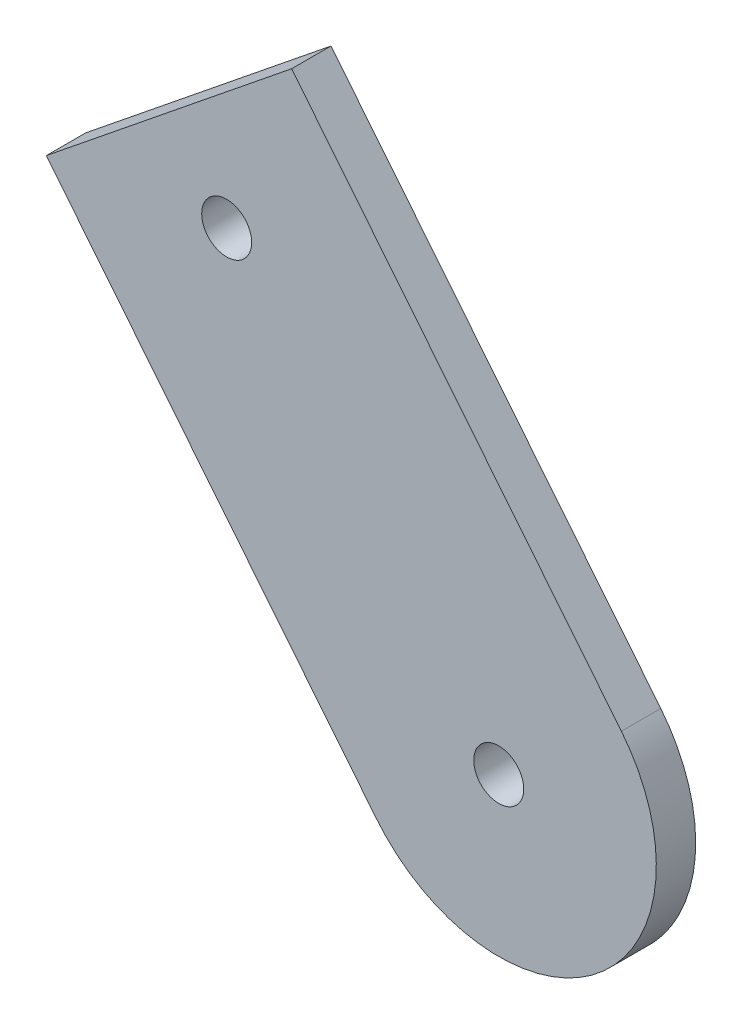
ISO-10303-21;
HEADER;
FILE_DESCRIPTION(('STEP AP214'),'2;1');
FILE_NAME('part.step','',(''),(''),'','','');
FILE_SCHEMA(('AUTOMOTIVE_DESIGN { 1 0 10303 214 1 1 1 1 }'));
ENDSEC;
DATA;
#1=APPLICATION_CONTEXT('core data for automotive mechanical design processes');
#2=APPLICATION_PROTOCOL_DEFINITION('international standard','automotive_design',2000,#1);
#3=PRODUCT_CONTEXT('',#1,'mechanical');
#4=PRODUCT('Part','Part','',(#3));
#5=PRODUCT_RELATED_PRODUCT_CATEGORY('part','',(#4));
#6=PRODUCT_DEFINITION_FORMATION('','',#4);
#7=PRODUCT_DEFINITION_CONTEXT('part definition',#1,'design');
#8=PRODUCT_DEFINITION('design','',#6,#7);
#9=PRODUCT_DEFINITION_SHAPE('','',#8);
#10=(LENGTH_UNIT() NAMED_UNIT(*) SI_UNIT(.MILLI.,.METRE.));
#11=(NAMED_UNIT(*) PLANE_ANGLE_UNIT() SI_UNIT($,.RADIAN.));
#12=(NAMED_UNIT(*) SI_UNIT($,.STERADIAN.) SOLID_ANGLE_UNIT());
#13=UNCERTAINTY_MEASURE_WITH_UNIT(LENGTH_MEASURE(1.E-05),#10,'distance_accuracy_value','');
#14=(GEOMETRIC_REPRESENTATION_CONTEXT(3) GLOBAL_UNCERTAINTY_ASSIGNED_CONTEXT((#13)) GLOBAL_UNIT_ASSIGNED_CONTEXT((#10,
#11,#12)) REPRESENTATION_CONTEXT('',''));
#15=CARTESIAN_POINT('',(0.,0.,0.));
#16=DIRECTION('',(0.,0.,1.));
#17=DIRECTION('',(1.,0.,0.));
#18=AXIS2_PLACEMENT_3D('',#15,#16,#17);
#19=CARTESIAN_POINT('',(237.229605795003,49.3106776484442,45.7810125842779));
#20=DIRECTION('',(0.,0.,-1.));
#21=DIRECTION('',(-1.,0.,0.));
#22=AXIS2_PLACEMENT_3D('',#19,#20,#21);
#23=PLANE('',#22);
#24=CARTESIAN_POINT('',(237.229605795003,49.3106776484442,45.7810125842779));
#25=DIRECTION('',(0.,0.,-1.));
#26=DIRECTION('',(-1.,0.,0.));
#27=AXIS2_PLACEMENT_3D('',#24,#25,#26);
#28=CIRCLE('',#27,1.90238919097048);
#29=CARTESIAN_POINT('',(235.327216604032,49.3106776484442,45.7810125842779));
#30=VERTEX_POINT('',#29);
#31=EDGE_CURVE('E100',#30,#30,#28,.T.);
#32=ORIENTED_EDGE('',*,*,#31,.F.);
#33=EDGE_LOOP('',(#32));
#34=FACE_BOUND('',#33,.T.);
#35=CARTESIAN_POINT('',(237.229605795003,49.3106776484442,45.7810125842779));
#36=DIRECTION('',(0.,0.,-1.));
#37=DIRECTION('',(-1.,0.,0.));
#38=AXIS2_PLACEMENT_3D('',#35,#36,#37);
#39=CIRCLE('',#38,11.9999999999999);
#40=CARTESIAN_POINT('',(246.569633902831,56.8448580913816,45.7810125842779));
#41=VERTEX_POINT('',#40);
#42=CARTESIAN_POINT('',(227.889577687194,41.7764972057179,45.7810125842779));
#43=VERTEX_POINT('',#42);
#44=EDGE_CURVE('E85',#41,#43,#39,.T.);
#45=ORIENTED_EDGE('',*,*,#44,.T.);
#46=DIRECTION('',(-0.627848370235994,0.778335675651583,0.));
#47=VECTOR('',#46,1.);
#48=CARTESIAN_POINT('',(202.775642877802,72.9099242317221,45.7810125842779));
#49=LINE('',#48,#47);
#50=CARTESIAN_POINT('',(202.775642877802,72.9099242317221,45.7810125842779));
#51=VERTEX_POINT('',#50);
#52=EDGE_CURVE('E80',#43,#51,#49,.T.);
#53=ORIENTED_EDGE('',*,*,#52,.T.);
#54=DIRECTION('',(0.778335675651583,0.627848370235994,0.));
#55=VECTOR('',#54,1.);
#56=CARTESIAN_POINT('',(221.455699093439,87.9782851173858,45.7810125842779));
#57=LINE('',#56,#55);
#58=CARTESIAN_POINT('',(221.455699093439,87.9782851173858,45.7810125842779));
#59=VERTEX_POINT('',#58);
#60=EDGE_CURVE('E83',#51,#59,#57,.T.);
#61=ORIENTED_EDGE('',*,*,#60,.T.);
#62=DIRECTION('',(0.627848370235994,-0.778335675651583,0.));
#63=VECTOR('',#62,1.);
#64=CARTESIAN_POINT('',(246.569633902831,56.8448580913816,45.7810125842779));
#65=LINE('',#64,#63);
#66=EDGE_CURVE('E50',#59,#41,#65,.T.);
#67=ORIENTED_EDGE('',*,*,#66,.T.);
#68=EDGE_LOOP('',(#45,#53,#61,#67));
#69=FACE_BOUND('',#68,.T.);
#70=CARTESIAN_POINT('',(216.510609577272,74.9957549449928,45.7810125842779));
#71=DIRECTION('',(0.,0.,-1.));
#72=DIRECTION('',(-1.,0.,0.));
#73=AXIS2_PLACEMENT_3D('',#70,#71,#72);
#74=CIRCLE('',#73,1.90238919100864);
#75=CARTESIAN_POINT('',(214.608220386264,74.9957549449928,45.7810125842779));
#76=VERTEX_POINT('',#75);
#77=EDGE_CURVE('E115',#76,#76,#74,.T.);
#78=ORIENTED_EDGE('',*,*,#77,.F.);
#79=EDGE_LOOP('',(#78));
#80=FACE_BOUND('',#79,.T.);
#81=ADVANCED_FACE('F33',(#34,#69,#80),#23,.T.);
#82=CARTESIAN_POINT('',(237.229605795003,49.3106776484442,48.7810125842779));
#83=DIRECTION('',(0.,0.,-1.));
#84=DIRECTION('',(-1.,0.,0.));
#85=AXIS2_PLACEMENT_3D('',#82,#83,#84);
#86=PLANE('',#85);
#87=CARTESIAN_POINT('',(237.229605795003,49.3106776484442,48.7810125842779));
#88=DIRECTION('',(0.,0.,-1.));
#89=DIRECTION('',(-1.,0.,0.));
#90=AXIS2_PLACEMENT_3D('',#87,#88,#89);
#91=CIRCLE('',#90,11.9999999999999);
#92=CARTESIAN_POINT('',(246.569633902831,56.8448580913816,48.7810125842779));
#93=VERTEX_POINT('',#92);
#94=CARTESIAN_POINT('',(227.889577687194,41.7764972057179,48.7810125842779));
#95=VERTEX_POINT('',#94);
#96=EDGE_CURVE('E97',#93,#95,#91,.T.);
#97=ORIENTED_EDGE('',*,*,#96,.F.);
#98=DIRECTION('',(0.627848370235994,-0.778335675651583,0.));
#99=VECTOR('',#98,1.);
#100=CARTESIAN_POINT('',(246.569633902831,56.8448580913816,48.7810125842779));
#101=LINE('',#100,#99);
#102=CARTESIAN_POINT('',(221.455699093439,87.9782851173858,48.7810125842779));
#103=VERTEX_POINT('',#102);
#104=EDGE_CURVE('E73',#103,#93,#101,.T.);
#105=ORIENTED_EDGE('',*,*,#104,.F.);
#106=DIRECTION('',(0.778335675651583,0.627848370235994,0.));
#107=VECTOR('',#106,1.);
#108=CARTESIAN_POINT('',(221.455699093439,87.9782851173858,48.7810125842779));
#109=LINE('',#108,#107);
#110=CARTESIAN_POINT('',(202.775642877802,72.9099242317221,48.7810125842779));
#111=VERTEX_POINT('',#110);
#112=EDGE_CURVE('E67',#111,#103,#109,.T.);
#113=ORIENTED_EDGE('',*,*,#112,.F.);
#114=DIRECTION('',(-0.627848370235994,0.778335675651583,0.));
#115=VECTOR('',#114,1.);
#116=CARTESIAN_POINT('',(202.775642877802,72.9099242317221,48.7810125842779));
#117=LINE('',#116,#115);
#118=EDGE_CURVE('E89',#95,#111,#117,.T.);
#119=ORIENTED_EDGE('',*,*,#118,.F.);
#120=EDGE_LOOP('',(#97,#105,#113,#119));
#121=FACE_BOUND('',#120,.T.);
#122=CARTESIAN_POINT('',(237.229605795003,49.3106776484442,48.7810125842779));
#123=DIRECTION('',(0.,0.,-1.));
#124=DIRECTION('',(-1.,0.,0.));
#125=AXIS2_PLACEMENT_3D('',#122,#123,#124);
#126=CIRCLE('',#125,1.90238919097048);
#127=CARTESIAN_POINT('',(235.327216604032,49.3106776484442,48.7810125842779));
#128=VERTEX_POINT('',#127);
#129=EDGE_CURVE('E112',#128,#128,#126,.T.);
#130=ORIENTED_EDGE('',*,*,#129,.T.);
#131=EDGE_LOOP('',(#130));
#132=FACE_BOUND('',#131,.T.);
#133=CARTESIAN_POINT('',(216.510609577272,74.9957549449928,48.7810125842779));
#134=DIRECTION('',(0.,0.,-1.));
#135=DIRECTION('',(-1.,0.,0.));
#136=AXIS2_PLACEMENT_3D('',#133,#134,#135);
#137=CIRCLE('',#136,1.90238919100864);
#138=CARTESIAN_POINT('',(214.608220386264,74.9957549449928,48.7810125842779));
#139=VERTEX_POINT('',#138);
#140=EDGE_CURVE('E118',#139,#139,#137,.T.);
#141=ORIENTED_EDGE('',*,*,#140,.T.);
#142=EDGE_LOOP('',(#141));
#143=FACE_BOUND('',#142,.T.);
#144=ADVANCED_FACE('F108',(#121,#132,#143),#86,.F.);
#145=CARTESIAN_POINT('',(237.229605795003,49.3106776484442,45.7810125842779));
#146=DIRECTION('',(0.,0.,1.));
#147=DIRECTION('',(1.,0.,0.));
#148=AXIS2_PLACEMENT_3D('',#145,#146,#147);
#149=CYLINDRICAL_SURFACE('',#148,11.9999999999999);
#150=ORIENTED_EDGE('',*,*,#96,.T.);
#151=DIRECTION('',(0.,0.,1.));
#152=VECTOR('',#151,1.);
#153=CARTESIAN_POINT('',(227.889577687194,41.7764972057179,45.7810125842779));
#154=LINE('',#153,#152);
#155=EDGE_CURVE('E11',#43,#95,#154,.T.);
#156=ORIENTED_EDGE('',*,*,#155,.F.);
#157=ORIENTED_EDGE('',*,*,#44,.F.);
#158=DIRECTION('',(0.,0.,1.));
#159=VECTOR('',#158,1.);
#160=CARTESIAN_POINT('',(246.569633902831,56.8448580913816,45.7810125842779));
#161=LINE('',#160,#159);
#162=EDGE_CURVE('E93',#41,#93,#161,.T.);
#163=ORIENTED_EDGE('',*,*,#162,.T.);
#164=EDGE_LOOP('',(#150,#156,#157,#163));
#165=FACE_BOUND('',#164,.T.);
#166=ADVANCED_FACE('F35',(#165),#149,.T.);
#167=CARTESIAN_POINT('',(202.775642877802,72.9099242317221,45.7810125842779));
#168=DIRECTION('',(0.778335675651583,0.627848370235994,0.));
#169=DIRECTION('',(-0.627848370235994,0.778335675651583,0.));
#170=AXIS2_PLACEMENT_3D('',#167,#168,#169);
#171=PLANE('',#170);
#172=ORIENTED_EDGE('',*,*,#118,.T.);
#173=DIRECTION('',(0.,0.,1.));
#174=VECTOR('',#173,1.);
#175=CARTESIAN_POINT('',(202.775642877802,72.9099242317221,45.7810125842779));
#176=LINE('',#175,#174);
#177=EDGE_CURVE('E42',#51,#111,#176,.T.);
#178=ORIENTED_EDGE('',*,*,#177,.F.);
#179=ORIENTED_EDGE('',*,*,#52,.F.);
#180=ORIENTED_EDGE('',*,*,#155,.T.);
#181=EDGE_LOOP('',(#172,#178,#179,#180));
#182=FACE_BOUND('',#181,.T.);
#183=ADVANCED_FACE('F88',(#182),#171,.F.);
#184=CARTESIAN_POINT('',(221.455699093439,87.9782851173858,45.7810125842779));
#185=DIRECTION('',(0.627848370235994,-0.778335675651583,0.));
#186=DIRECTION('',(0.778335675651583,0.627848370235994,0.));
#187=AXIS2_PLACEMENT_3D('',#184,#185,#186);
#188=PLANE('',#187);
#189=ORIENTED_EDGE('',*,*,#112,.T.);
#190=DIRECTION('',(0.,0.,1.));
#191=VECTOR('',#190,1.);
#192=CARTESIAN_POINT('',(221.455699093439,87.9782851173858,45.7810125842779));
#193=LINE('',#192,#191);
#194=EDGE_CURVE('E90',#59,#103,#193,.T.);
#195=ORIENTED_EDGE('',*,*,#194,.F.);
#196=ORIENTED_EDGE('',*,*,#60,.F.);
#197=ORIENTED_EDGE('',*,*,#177,.T.);
#198=EDGE_LOOP('',(#189,#195,#196,#197));
#199=FACE_BOUND('',#198,.T.);
#200=ADVANCED_FACE('F91',(#199),#188,.F.);
#201=CARTESIAN_POINT('',(246.569633902831,56.8448580913816,45.7810125842779));
#202=DIRECTION('',(-0.778335675651583,-0.627848370235994,0.));
#203=DIRECTION('',(0.627848370235994,-0.778335675651583,0.));
#204=AXIS2_PLACEMENT_3D('',#201,#202,#203);
#205=PLANE('',#204);
#206=ORIENTED_EDGE('',*,*,#104,.T.);
#207=ORIENTED_EDGE('',*,*,#162,.F.);
#208=ORIENTED_EDGE('',*,*,#66,.F.);
#209=ORIENTED_EDGE('',*,*,#194,.T.);
#210=EDGE_LOOP('',(#206,#207,#208,#209));
#211=FACE_BOUND('',#210,.T.);
#212=ADVANCED_FACE('F105',(#211),#205,.F.);
#213=CARTESIAN_POINT('',(237.229605795003,49.3106776484442,45.7810125842779));
#214=DIRECTION('',(0.,0.,1.));
#215=DIRECTION('',(1.,0.,0.));
#216=AXIS2_PLACEMENT_3D('',#213,#214,#215);
#217=CYLINDRICAL_SURFACE('',#216,1.90238919097048);
#218=ORIENTED_EDGE('',*,*,#31,.T.);
#219=EDGE_LOOP('',(#218));
#220=FACE_BOUND('',#219,.T.);
#221=ORIENTED_EDGE('',*,*,#129,.F.);
#222=EDGE_LOOP('',(#221));
#223=FACE_BOUND('',#222,.T.);
#224=ADVANCED_FACE('F135',(#220,#223),#217,.F.);
#225=CARTESIAN_POINT('',(216.510609577272,74.9957549449928,45.7810125842779));
#226=DIRECTION('',(0.,0.,1.));
#227=DIRECTION('',(1.,0.,0.));
#228=AXIS2_PLACEMENT_3D('',#225,#226,#227);
#229=CYLINDRICAL_SURFACE('',#228,1.90238919100864);
#230=ORIENTED_EDGE('',*,*,#77,.T.);
#231=EDGE_LOOP('',(#230));
#232=FACE_BOUND('',#231,.T.);
#233=ORIENTED_EDGE('',*,*,#140,.F.);
#234=EDGE_LOOP('',(#233));
#235=FACE_BOUND('',#234,.T.);
#236=ADVANCED_FACE('F124',(#232,#235),#229,.F.);
#237=CLOSED_SHELL('',(#81,#144,#166,#183,#200,#212,#224,#236));
#238=MANIFOLD_SOLID_BREP('B2',#237);
#239=ADVANCED_BREP_SHAPE_REPRESENTATION('',(#18,#238),#14);
#240=SHAPE_DEFINITION_REPRESENTATION(#9,#239);
ENDSEC;
END-ISO-10303-21;
